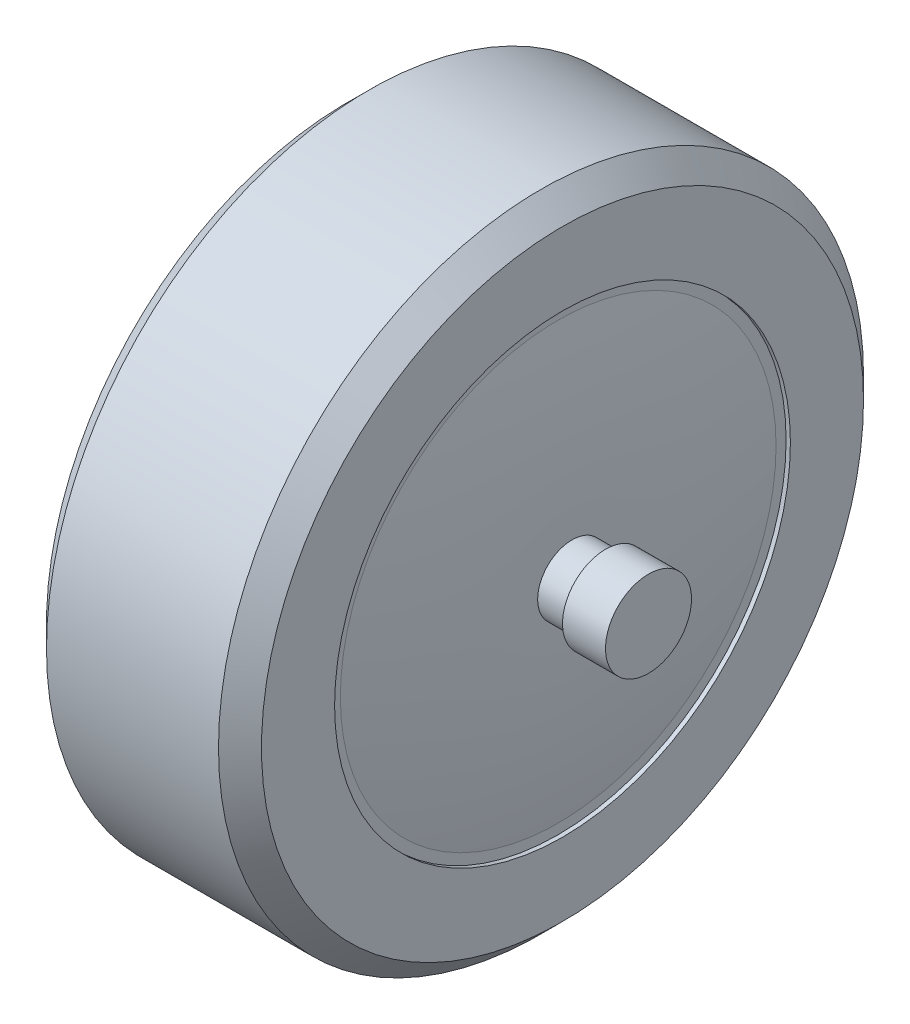
ISO-10303-21;
HEADER;
FILE_DESCRIPTION(('STEP AP214'),'2;1');
FILE_NAME('part.step','',(''),(''),'','','');
FILE_SCHEMA(('AUTOMOTIVE_DESIGN { 1 0 10303 214 1 1 1 1 }'));
ENDSEC;
DATA;
#1=APPLICATION_CONTEXT('core data for automotive mechanical design processes');
#2=APPLICATION_PROTOCOL_DEFINITION('international standard','automotive_design',2000,#1);
#3=PRODUCT_CONTEXT('',#1,'mechanical');
#4=PRODUCT('Part','Part','',(#3));
#5=PRODUCT_RELATED_PRODUCT_CATEGORY('part','',(#4));
#6=PRODUCT_DEFINITION_FORMATION('','',#4);
#7=PRODUCT_DEFINITION_CONTEXT('part definition',#1,'design');
#8=PRODUCT_DEFINITION('design','',#6,#7);
#9=PRODUCT_DEFINITION_SHAPE('','',#8);
#10=(LENGTH_UNIT() NAMED_UNIT(*) SI_UNIT(.MILLI.,.METRE.));
#11=(NAMED_UNIT(*) PLANE_ANGLE_UNIT() SI_UNIT($,.RADIAN.));
#12=(NAMED_UNIT(*) SI_UNIT($,.STERADIAN.) SOLID_ANGLE_UNIT());
#13=UNCERTAINTY_MEASURE_WITH_UNIT(LENGTH_MEASURE(1.E-05),#10,'distance_accuracy_value','');
#14=(GEOMETRIC_REPRESENTATION_CONTEXT(3) GLOBAL_UNCERTAINTY_ASSIGNED_CONTEXT((#13)) GLOBAL_UNIT_ASSIGNED_CONTEXT((#10,
#11,#12)) REPRESENTATION_CONTEXT('',''));
#15=CARTESIAN_POINT('',(0.,0.,0.));
#16=DIRECTION('',(0.,0.,1.));
#17=DIRECTION('',(1.,0.,0.));
#18=AXIS2_PLACEMENT_3D('',#15,#16,#17);
#19=CARTESIAN_POINT('',(-25.,0.,0.));
#20=DIRECTION('',(1.,0.,0.));
#21=DIRECTION('',(0.,0.,-1.));
#22=AXIS2_PLACEMENT_3D('',#19,#20,#21);
#23=PLANE('',#22);
#24=CARTESIAN_POINT('',(-25.,0.,0.));
#25=DIRECTION('',(1.,0.,0.));
#26=DIRECTION('',(0.,0.,-1.));
#27=AXIS2_PLACEMENT_3D('',#24,#25,#26);
#28=CIRCLE('',#27,70.);
#29=CARTESIAN_POINT('',(-25.,0.,-70.));
#30=VERTEX_POINT('',#29);
#31=EDGE_CURVE('E49',#30,#30,#28,.F.);
#32=ORIENTED_EDGE('',*,*,#31,.T.);
#33=EDGE_LOOP('',(#32));
#34=FACE_BOUND('',#33,.T.);
#35=CARTESIAN_POINT('',(-25.,0.,0.));
#36=DIRECTION('',(1.,0.,0.));
#37=DIRECTION('',(0.,0.,-1.));
#38=AXIS2_PLACEMENT_3D('',#35,#36,#37);
#39=CIRCLE('',#38,53.);
#40=CARTESIAN_POINT('',(-25.,0.,-53.));
#41=VERTEX_POINT('',#40);
#42=EDGE_CURVE('E85',#41,#41,#39,.T.);
#43=ORIENTED_EDGE('',*,*,#42,.T.);
#44=EDGE_LOOP('',(#43));
#45=FACE_BOUND('',#44,.T.);
#46=ADVANCED_FACE('F34',(#34,#45),#23,.F.);
#47=CARTESIAN_POINT('',(25.,0.,0.));
#48=DIRECTION('',(-1.,0.,0.));
#49=DIRECTION('',(0.,0.,1.));
#50=AXIS2_PLACEMENT_3D('',#47,#48,#49);
#51=CYLINDRICAL_SURFACE('',#50,75.);
#52=CARTESIAN_POINT('',(-20.,0.,0.));
#53=DIRECTION('',(1.,0.,0.));
#54=DIRECTION('',(0.,0.,-1.));
#55=AXIS2_PLACEMENT_3D('',#52,#53,#54);
#56=CIRCLE('',#55,75.);
#57=CARTESIAN_POINT('',(-20.,0.,-75.));
#58=VERTEX_POINT('',#57);
#59=EDGE_CURVE('E54',#58,#58,#56,.T.);
#60=ORIENTED_EDGE('',*,*,#59,.T.);
#61=EDGE_LOOP('',(#60));
#62=FACE_BOUND('',#61,.T.);
#63=CARTESIAN_POINT('',(20.,0.,0.));
#64=DIRECTION('',(1.,0.,0.));
#65=DIRECTION('',(0.,0.,-1.));
#66=AXIS2_PLACEMENT_3D('',#63,#64,#65);
#67=CIRCLE('',#66,75.);
#68=CARTESIAN_POINT('',(20.,0.,-75.));
#69=VERTEX_POINT('',#68);
#70=EDGE_CURVE('E57',#69,#69,#67,.F.);
#71=ORIENTED_EDGE('',*,*,#70,.T.);
#72=EDGE_LOOP('',(#71));
#73=FACE_BOUND('',#72,.T.);
#74=ADVANCED_FACE('F158',(#62,#73),#51,.T.);
#75=CARTESIAN_POINT('',(25.,0.,0.));
#76=DIRECTION('',(1.,0.,0.));
#77=DIRECTION('',(0.,0.,-1.));
#78=AXIS2_PLACEMENT_3D('',#75,#76,#77);
#79=PLANE('',#78);
#80=CARTESIAN_POINT('',(25.,0.,0.));
#81=DIRECTION('',(1.,0.,0.));
#82=DIRECTION('',(0.,0.,-1.));
#83=AXIS2_PLACEMENT_3D('',#80,#81,#82);
#84=CIRCLE('',#83,53.);
#85=CARTESIAN_POINT('',(25.,0.,-53.));
#86=VERTEX_POINT('',#85);
#87=EDGE_CURVE('E79',#86,#86,#84,.T.);
#88=ORIENTED_EDGE('',*,*,#87,.F.);
#89=EDGE_LOOP('',(#88));
#90=FACE_BOUND('',#89,.T.);
#91=CARTESIAN_POINT('',(25.,0.,0.));
#92=DIRECTION('',(1.,0.,0.));
#93=DIRECTION('',(0.,0.,-1.));
#94=AXIS2_PLACEMENT_3D('',#91,#92,#93);
#95=CIRCLE('',#94,70.);
#96=CARTESIAN_POINT('',(25.,0.,-70.));
#97=VERTEX_POINT('',#96);
#98=EDGE_CURVE('E45',#97,#97,#95,.T.);
#99=ORIENTED_EDGE('',*,*,#98,.T.);
#100=EDGE_LOOP('',(#99));
#101=FACE_BOUND('',#100,.T.);
#102=ADVANCED_FACE('F154',(#90,#101),#79,.T.);
#103=CARTESIAN_POINT('',(-20.,0.,0.));
#104=DIRECTION('',(1.,0.,0.));
#105=DIRECTION('',(0.,0.,-1.));
#106=AXIS2_PLACEMENT_3D('',#103,#104,#105);
#107=CONICAL_SURFACE('',#106,75.,0.785398163397451);
#108=ORIENTED_EDGE('',*,*,#31,.F.);
#109=EDGE_LOOP('',(#108));
#110=FACE_BOUND('',#109,.T.);
#111=ORIENTED_EDGE('',*,*,#59,.F.);
#112=EDGE_LOOP('',(#111));
#113=FACE_BOUND('',#112,.T.);
#114=ADVANCED_FACE('F157',(#110,#113),#107,.T.);
#115=CARTESIAN_POINT('',(25.,0.,0.));
#116=DIRECTION('',(-1.,0.,0.));
#117=DIRECTION('',(0.,0.,1.));
#118=AXIS2_PLACEMENT_3D('',#115,#116,#117);
#119=CONICAL_SURFACE('',#118,70.,0.785398163397448);
#120=ORIENTED_EDGE('',*,*,#70,.F.);
#121=EDGE_LOOP('',(#120));
#122=FACE_BOUND('',#121,.T.);
#123=ORIENTED_EDGE('',*,*,#98,.F.);
#124=EDGE_LOOP('',(#123));
#125=FACE_BOUND('',#124,.T.);
#126=ADVANCED_FACE('F36',(#122,#125),#119,.T.);
#127=CARTESIAN_POINT('',(24.,0.,0.));
#128=DIRECTION('',(1.,0.,0.));
#129=DIRECTION('',(0.,0.,-1.));
#130=AXIS2_PLACEMENT_3D('',#127,#128,#129);
#131=CYLINDRICAL_SURFACE('',#130,53.);
#132=CARTESIAN_POINT('',(24.,0.,0.));
#133=DIRECTION('',(1.,0.,0.));
#134=DIRECTION('',(0.,0.,-1.));
#135=AXIS2_PLACEMENT_3D('',#132,#133,#134);
#136=CIRCLE('',#135,53.);
#137=CARTESIAN_POINT('',(24.,0.,-53.));
#138=VERTEX_POINT('',#137);
#139=EDGE_CURVE('E76',#138,#138,#136,.T.);
#140=ORIENTED_EDGE('',*,*,#139,.F.);
#141=EDGE_LOOP('',(#140));
#142=FACE_BOUND('',#141,.T.);
#143=ORIENTED_EDGE('',*,*,#87,.T.);
#144=EDGE_LOOP('',(#143));
#145=FACE_BOUND('',#144,.T.);
#146=ADVANCED_FACE('F121',(#142,#145),#131,.F.);
#147=CARTESIAN_POINT('',(24.,0.,0.));
#148=DIRECTION('',(1.,0.,0.));
#149=DIRECTION('',(0.,0.,-1.));
#150=AXIS2_PLACEMENT_3D('',#147,#148,#149);
#151=PLANE('',#150);
#152=CARTESIAN_POINT('',(24.,0.,0.));
#153=DIRECTION('',(-1.,0.,0.));
#154=DIRECTION('',(0.,0.,1.));
#155=AXIS2_PLACEMENT_3D('',#152,#153,#154);
#156=CIRCLE('',#155,50.6611661778371);
#157=CARTESIAN_POINT('',(24.,0.,50.6611661778371));
#158=VERTEX_POINT('',#157);
#159=EDGE_CURVE('E88',#158,#158,#156,.T.);
#160=ORIENTED_EDGE('',*,*,#159,.T.);
#161=EDGE_LOOP('',(#160));
#162=FACE_BOUND('',#161,.T.);
#163=ORIENTED_EDGE('',*,*,#139,.T.);
#164=EDGE_LOOP('',(#163));
#165=FACE_BOUND('',#164,.T.);
#166=ADVANCED_FACE('F114',(#162,#165),#151,.T.);
#167=CARTESIAN_POINT('',(-24.,0.,0.));
#168=DIRECTION('',(-1.,0.,0.));
#169=DIRECTION('',(0.,0.,-1.));
#170=AXIS2_PLACEMENT_3D('',#167,#168,#169);
#171=PLANE('',#170);
#172=CARTESIAN_POINT('',(-24.,0.,0.));
#173=DIRECTION('',(-1.,0.,0.));
#174=DIRECTION('',(0.,0.,1.));
#175=AXIS2_PLACEMENT_3D('',#172,#173,#174);
#176=CIRCLE('',#175,50.6611661778371);
#177=CARTESIAN_POINT('',(-24.,0.,50.6611661778371));
#178=VERTEX_POINT('',#177);
#179=EDGE_CURVE('E93',#178,#178,#176,.T.);
#180=ORIENTED_EDGE('',*,*,#179,.F.);
#181=EDGE_LOOP('',(#180));
#182=FACE_BOUND('',#181,.T.);
#183=CARTESIAN_POINT('',(-24.,0.,0.));
#184=DIRECTION('',(1.,0.,0.));
#185=DIRECTION('',(0.,0.,-1.));
#186=AXIS2_PLACEMENT_3D('',#183,#184,#185);
#187=CIRCLE('',#186,53.);
#188=CARTESIAN_POINT('',(-24.,0.,-53.));
#189=VERTEX_POINT('',#188);
#190=EDGE_CURVE('E82',#189,#189,#187,.T.);
#191=ORIENTED_EDGE('',*,*,#190,.F.);
#192=EDGE_LOOP('',(#191));
#193=FACE_BOUND('',#192,.T.);
#194=ADVANCED_FACE('F111',(#182,#193),#171,.T.);
#195=CARTESIAN_POINT('',(-24.,0.,0.));
#196=DIRECTION('',(-1.,0.,0.));
#197=DIRECTION('',(0.,0.,1.));
#198=AXIS2_PLACEMENT_3D('',#195,#196,#197);
#199=CYLINDRICAL_SURFACE('',#198,53.);
#200=ORIENTED_EDGE('',*,*,#190,.T.);
#201=EDGE_LOOP('',(#200));
#202=FACE_BOUND('',#201,.T.);
#203=ORIENTED_EDGE('',*,*,#42,.F.);
#204=EDGE_LOOP('',(#203));
#205=FACE_BOUND('',#204,.T.);
#206=ADVANCED_FACE('F108',(#202,#205),#199,.F.);
#207=CARTESIAN_POINT('',(27.,0.,0.));
#208=CARTESIAN_POINT('',(28.0995961935109,0.,-25.4639231277384));
#209=CARTESIAN_POINT('',(24.,0.,-50.6611661778371));
#210=B_SPLINE_CURVE_WITH_KNOTS('',2,(#207,#208,#209),.UNSPECIFIED.,.F.,.F.,(3,3),(0.,1.),.UNSPECIFIED.);
#211=CARTESIAN_POINT('',(27.,0.,0.));
#212=DIRECTION('',(-1.,0.,0.));
#213=AXIS1_PLACEMENT('',#211,#212);
#214=SURFACE_OF_REVOLUTION('',#210,#213);
#215=ORIENTED_EDGE('',*,*,#159,.F.);
#216=EDGE_LOOP('',(#215));
#217=FACE_BOUND('',#216,.T.);
#218=CARTESIAN_POINT('',(27.217239567852,0.,0.));
#219=DIRECTION('',(-1.,0.,0.));
#220=DIRECTION('',(0.,0.,1.));
#221=AXIS2_PLACEMENT_3D('',#218,#219,#220);
#222=CIRCLE('',#221,8.);
#223=CARTESIAN_POINT('',(27.217239567852,0.,8.));
#224=VERTEX_POINT('',#223);
#225=EDGE_CURVE('E41',#224,#224,#222,.T.);
#226=ORIENTED_EDGE('',*,*,#225,.T.);
#227=EDGE_LOOP('',(#226));
#228=FACE_BOUND('',#227,.T.);
#229=ADVANCED_FACE('F103',(#217,#228),#214,.T.);
#230=CARTESIAN_POINT('',(45.,0.,0.));
#231=DIRECTION('',(1.,0.,0.));
#232=DIRECTION('',(0.,0.,-1.));
#233=AXIS2_PLACEMENT_3D('',#230,#231,#232);
#234=PLANE('',#233);
#235=CARTESIAN_POINT('',(45.,0.,0.));
#236=DIRECTION('',(1.,0.,0.));
#237=DIRECTION('',(0.,0.,-1.));
#238=AXIS2_PLACEMENT_3D('',#235,#236,#237);
#239=CIRCLE('',#238,10.);
#240=CARTESIAN_POINT('',(45.,0.,-10.));
#241=VERTEX_POINT('',#240);
#242=EDGE_CURVE('E68',#241,#241,#239,.T.);
#243=ORIENTED_EDGE('',*,*,#242,.T.);
#244=EDGE_LOOP('',(#243));
#245=FACE_BOUND('',#244,.T.);
#246=ADVANCED_FACE('F107',(#245),#234,.T.);
#247=CARTESIAN_POINT('',(45.,0.,0.));
#248=DIRECTION('',(-1.,0.,0.));
#249=DIRECTION('',(0.,0.,1.));
#250=AXIS2_PLACEMENT_3D('',#247,#248,#249);
#251=CYLINDRICAL_SURFACE('',#250,10.);
#252=ORIENTED_EDGE('',*,*,#242,.F.);
#253=EDGE_LOOP('',(#252));
#254=FACE_BOUND('',#253,.T.);
#255=CARTESIAN_POINT('',(35.,0.,0.));
#256=DIRECTION('',(1.,0.,0.));
#257=DIRECTION('',(0.,0.,-1.));
#258=AXIS2_PLACEMENT_3D('',#255,#256,#257);
#259=CIRCLE('',#258,10.);
#260=CARTESIAN_POINT('',(35.,0.,-10.));
#261=VERTEX_POINT('',#260);
#262=EDGE_CURVE('E64',#261,#261,#259,.T.);
#263=ORIENTED_EDGE('',*,*,#262,.T.);
#264=EDGE_LOOP('',(#263));
#265=FACE_BOUND('',#264,.T.);
#266=ADVANCED_FACE('F141',(#254,#265),#251,.T.);
#267=CARTESIAN_POINT('',(35.,0.,0.));
#268=DIRECTION('',(1.,0.,0.));
#269=DIRECTION('',(0.,0.,-1.));
#270=AXIS2_PLACEMENT_3D('',#267,#268,#269);
#271=PLANE('',#270);
#272=CARTESIAN_POINT('',(35.,0.,0.));
#273=DIRECTION('',(1.,0.,0.));
#274=DIRECTION('',(0.,0.,-1.));
#275=AXIS2_PLACEMENT_3D('',#272,#273,#274);
#276=CIRCLE('',#275,8.);
#277=CARTESIAN_POINT('',(35.,0.,-8.));
#278=VERTEX_POINT('',#277);
#279=EDGE_CURVE('E60',#278,#278,#276,.T.);
#280=ORIENTED_EDGE('',*,*,#279,.T.);
#281=EDGE_LOOP('',(#280));
#282=FACE_BOUND('',#281,.T.);
#283=ORIENTED_EDGE('',*,*,#262,.F.);
#284=EDGE_LOOP('',(#283));
#285=FACE_BOUND('',#284,.T.);
#286=ADVANCED_FACE('F143',(#282,#285),#271,.F.);
#287=CARTESIAN_POINT('',(35.,0.,0.));
#288=DIRECTION('',(-1.,0.,0.));
#289=DIRECTION('',(0.,0.,1.));
#290=AXIS2_PLACEMENT_3D('',#287,#288,#289);
#291=CYLINDRICAL_SURFACE('',#290,8.);
#292=ORIENTED_EDGE('',*,*,#279,.F.);
#293=EDGE_LOOP('',(#292));
#294=FACE_BOUND('',#293,.T.);
#295=ORIENTED_EDGE('',*,*,#225,.F.);
#296=EDGE_LOOP('',(#295));
#297=FACE_BOUND('',#296,.T.);
#298=ADVANCED_FACE('F146',(#294,#297),#291,.T.);
#299=CARTESIAN_POINT('',(-27.,0.,0.));
#300=CARTESIAN_POINT('',(-28.0995961935109,0.,-25.4639231277384));
#301=CARTESIAN_POINT('',(-24.,0.,-50.6611661778371));
#302=B_SPLINE_CURVE_WITH_KNOTS('',2,(#299,#300,#301),.UNSPECIFIED.,.F.,.F.,(3,3),(0.,1.),.UNSPECIFIED.);
#303=CARTESIAN_POINT('',(-27.,0.,0.));
#304=DIRECTION('',(1.,0.,0.));
#305=AXIS1_PLACEMENT('',#303,#304);
#306=SURFACE_OF_REVOLUTION('',#302,#305);
#307=ORIENTED_EDGE('',*,*,#179,.T.);
#308=EDGE_LOOP('',(#307));
#309=FACE_BOUND('',#308,.T.);
#310=CARTESIAN_POINT('',(-27.217239567852,0.,0.));
#311=DIRECTION('',(1.,0.,0.));
#312=DIRECTION('',(0.,0.,-1.));
#313=AXIS2_PLACEMENT_3D('',#310,#311,#312);
#314=CIRCLE('',#313,8.);
#315=CARTESIAN_POINT('',(-27.217239567852,0.,-8.));
#316=VERTEX_POINT('',#315);
#317=EDGE_CURVE('E10',#316,#316,#314,.T.);
#318=ORIENTED_EDGE('',*,*,#317,.T.);
#319=EDGE_LOOP('',(#318));
#320=FACE_BOUND('',#319,.T.);
#321=ADVANCED_FACE('F110',(#309,#320),#306,.T.);
#322=CARTESIAN_POINT('',(-45.,0.,0.));
#323=DIRECTION('',(-1.,0.,0.));
#324=DIRECTION('',(0.,0.,-1.));
#325=AXIS2_PLACEMENT_3D('',#322,#323,#324);
#326=PLANE('',#325);
#327=CARTESIAN_POINT('',(-45.,0.,0.));
#328=DIRECTION('',(1.,0.,0.));
#329=DIRECTION('',(0.,0.,-1.));
#330=AXIS2_PLACEMENT_3D('',#327,#328,#329);
#331=CIRCLE('',#330,10.);
#332=CARTESIAN_POINT('',(-45.,0.,-10.));
#333=VERTEX_POINT('',#332);
#334=EDGE_CURVE('E65',#333,#333,#331,.T.);
#335=ORIENTED_EDGE('',*,*,#334,.F.);
#336=EDGE_LOOP('',(#335));
#337=FACE_BOUND('',#336,.T.);
#338=ADVANCED_FACE('F126',(#337),#326,.T.);
#339=CARTESIAN_POINT('',(-45.,0.,0.));
#340=DIRECTION('',(1.,0.,0.));
#341=DIRECTION('',(0.,0.,-1.));
#342=AXIS2_PLACEMENT_3D('',#339,#340,#341);
#343=CYLINDRICAL_SURFACE('',#342,10.);
#344=ORIENTED_EDGE('',*,*,#334,.T.);
#345=EDGE_LOOP('',(#344));
#346=FACE_BOUND('',#345,.T.);
#347=CARTESIAN_POINT('',(-35.,0.,0.));
#348=DIRECTION('',(1.,0.,0.));
#349=DIRECTION('',(0.,0.,-1.));
#350=AXIS2_PLACEMENT_3D('',#347,#348,#349);
#351=CIRCLE('',#350,10.);
#352=CARTESIAN_POINT('',(-35.,0.,-10.));
#353=VERTEX_POINT('',#352);
#354=EDGE_CURVE('E73',#353,#353,#351,.T.);
#355=ORIENTED_EDGE('',*,*,#354,.F.);
#356=EDGE_LOOP('',(#355));
#357=FACE_BOUND('',#356,.T.);
#358=ADVANCED_FACE('F129',(#346,#357),#343,.T.);
#359=CARTESIAN_POINT('',(-35.,0.,0.));
#360=DIRECTION('',(-1.,0.,0.));
#361=DIRECTION('',(0.,0.,-1.));
#362=AXIS2_PLACEMENT_3D('',#359,#360,#361);
#363=PLANE('',#362);
#364=CARTESIAN_POINT('',(-35.,0.,0.));
#365=DIRECTION('',(1.,0.,0.));
#366=DIRECTION('',(0.,0.,-1.));
#367=AXIS2_PLACEMENT_3D('',#364,#365,#366);
#368=CIRCLE('',#367,8.);
#369=CARTESIAN_POINT('',(-35.,0.,-8.));
#370=VERTEX_POINT('',#369);
#371=EDGE_CURVE('E61',#370,#370,#368,.T.);
#372=ORIENTED_EDGE('',*,*,#371,.F.);
#373=EDGE_LOOP('',(#372));
#374=FACE_BOUND('',#373,.T.);
#375=ORIENTED_EDGE('',*,*,#354,.T.);
#376=EDGE_LOOP('',(#375));
#377=FACE_BOUND('',#376,.T.);
#378=ADVANCED_FACE('F131',(#374,#377),#363,.F.);
#379=ORIENTED_EDGE('',*,*,#371,.T.);
#380=EDGE_LOOP('',(#379));
#381=FACE_BOUND('',#380,.T.);
#382=ORIENTED_EDGE('',*,*,#317,.F.);
#383=EDGE_LOOP('',(#382));
#384=FACE_BOUND('',#383,.T.);
#385=ADVANCED_FACE('F134',(#381,#384),#291,.T.);
#386=CLOSED_SHELL('',(#46,#74,#102,#114,#126,#146,#166,#194,#206,#229,#246,#266,#286,#298,#321,
#338,#358,#378,#385));
#387=MANIFOLD_SOLID_BREP('B2',#386);
#388=ADVANCED_BREP_SHAPE_REPRESENTATION('',(#18,#387),#14);
#389=SHAPE_DEFINITION_REPRESENTATION(#9,#388);
ENDSEC;
END-ISO-10303-21;
